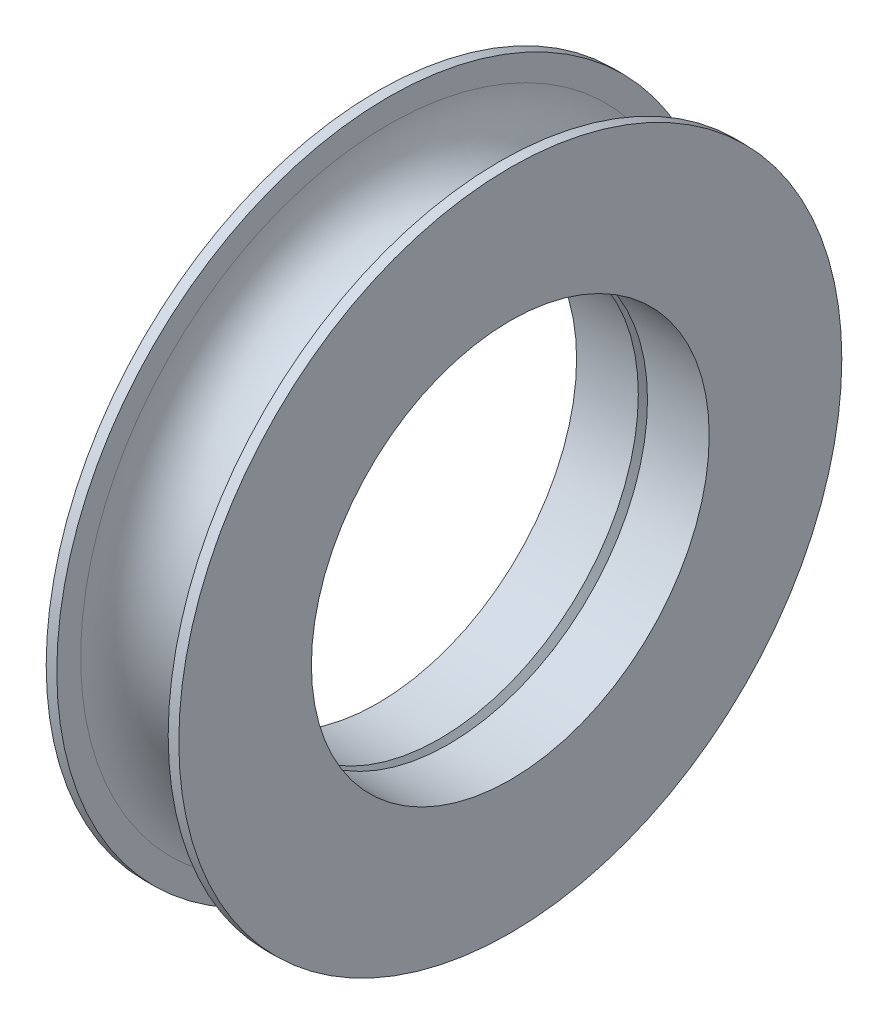
ISO-10303-21;
HEADER;
FILE_DESCRIPTION(('STEP AP214'),'2;1');
FILE_NAME('part.step','',(''),(''),'','','');
FILE_SCHEMA(('AUTOMOTIVE_DESIGN { 1 0 10303 214 1 1 1 1 }'));
ENDSEC;
DATA;
#1=APPLICATION_CONTEXT('core data for automotive mechanical design processes');
#2=APPLICATION_PROTOCOL_DEFINITION('international standard','automotive_design',2000,#1);
#3=PRODUCT_CONTEXT('',#1,'mechanical');
#4=PRODUCT('Part','Part','',(#3));
#5=PRODUCT_RELATED_PRODUCT_CATEGORY('part','',(#4));
#6=PRODUCT_DEFINITION_FORMATION('','',#4);
#7=PRODUCT_DEFINITION_CONTEXT('part definition',#1,'design');
#8=PRODUCT_DEFINITION('design','',#6,#7);
#9=PRODUCT_DEFINITION_SHAPE('','',#8);
#10=(LENGTH_UNIT() NAMED_UNIT(*) SI_UNIT(.MILLI.,.METRE.));
#11=(NAMED_UNIT(*) PLANE_ANGLE_UNIT() SI_UNIT($,.RADIAN.));
#12=(NAMED_UNIT(*) SI_UNIT($,.STERADIAN.) SOLID_ANGLE_UNIT());
#13=UNCERTAINTY_MEASURE_WITH_UNIT(LENGTH_MEASURE(1.E-05),#10,'distance_accuracy_value','');
#14=(GEOMETRIC_REPRESENTATION_CONTEXT(3) GLOBAL_UNCERTAINTY_ASSIGNED_CONTEXT((#13)) GLOBAL_UNIT_ASSIGNED_CONTEXT((#10,
#11,#12)) REPRESENTATION_CONTEXT('',''));
#15=CARTESIAN_POINT('',(0.,0.,0.));
#16=DIRECTION('',(0.,0.,1.));
#17=DIRECTION('',(1.,0.,0.));
#18=AXIS2_PLACEMENT_3D('',#15,#16,#17);
#19=CARTESIAN_POINT('',(0.,0.,0.));
#20=DIRECTION('',(-1.,0.,0.));
#21=DIRECTION('',(0.,0.,1.));
#22=AXIS2_PLACEMENT_3D('',#19,#20,#21);
#23=CONICAL_SURFACE('',#22,7.8,1.0471975511966);
#24=CARTESIAN_POINT('',(0.,0.,0.));
#25=DIRECTION('',(1.,0.,0.));
#26=DIRECTION('',(0.,0.,-1.));
#27=AXIS2_PLACEMENT_3D('',#24,#25,#26);
#28=CIRCLE('',#27,7.8);
#29=CARTESIAN_POINT('',(0.,0.,-7.8));
#30=VERTEX_POINT('',#29);
#31=EDGE_CURVE('E60',#30,#30,#28,.F.);
#32=ORIENTED_EDGE('',*,*,#31,.T.);
#33=EDGE_LOOP('',(#32));
#34=FACE_BOUND('',#33,.T.);
#35=CARTESIAN_POINT('',(0.173205080756888,0.,0.));
#36=DIRECTION('',(-1.,0.,0.));
#37=DIRECTION('',(0.,0.,1.));
#38=AXIS2_PLACEMENT_3D('',#35,#36,#37);
#39=CIRCLE('',#38,7.5);
#40=CARTESIAN_POINT('',(0.173205080756888,0.,7.5));
#41=VERTEX_POINT('',#40);
#42=EDGE_CURVE('E55',#41,#41,#39,.F.);
#43=ORIENTED_EDGE('',*,*,#42,.T.);
#44=EDGE_LOOP('',(#43));
#45=FACE_BOUND('',#44,.T.);
#46=ADVANCED_FACE('F14',(#34,#45),#23,.F.);
#47=CARTESIAN_POINT('',(0.,0.,0.));
#48=DIRECTION('',(1.,0.,0.));
#49=DIRECTION('',(0.,0.,-1.));
#50=AXIS2_PLACEMENT_3D('',#47,#48,#49);
#51=CONICAL_SURFACE('',#50,7.8,1.0471975511966);
#52=CARTESIAN_POINT('',(-0.173205080756888,0.,0.));
#53=DIRECTION('',(-1.,0.,0.));
#54=DIRECTION('',(0.,0.,1.));
#55=AXIS2_PLACEMENT_3D('',#52,#53,#54);
#56=CIRCLE('',#55,7.5);
#57=CARTESIAN_POINT('',(-0.173205080756888,0.,7.5));
#58=VERTEX_POINT('',#57);
#59=EDGE_CURVE('E51',#58,#58,#56,.T.);
#60=ORIENTED_EDGE('',*,*,#59,.T.);
#61=EDGE_LOOP('',(#60));
#62=FACE_BOUND('',#61,.T.);
#63=ORIENTED_EDGE('',*,*,#31,.F.);
#64=EDGE_LOOP('',(#63));
#65=FACE_BOUND('',#64,.T.);
#66=ADVANCED_FACE('F76',(#62,#65),#51,.F.);
#67=CARTESIAN_POINT('',(2.5,0.,0.));
#68=DIRECTION('',(-1.,0.,0.));
#69=DIRECTION('',(0.,0.,1.));
#70=AXIS2_PLACEMENT_3D('',#67,#68,#69);
#71=CYLINDRICAL_SURFACE('',#70,7.5);
#72=ORIENTED_EDGE('',*,*,#42,.F.);
#73=EDGE_LOOP('',(#72));
#74=FACE_BOUND('',#73,.T.);
#75=CARTESIAN_POINT('',(2.5,0.,0.));
#76=DIRECTION('',(-1.,0.,0.));
#77=DIRECTION('',(0.,0.,1.));
#78=AXIS2_PLACEMENT_3D('',#75,#76,#77);
#79=CIRCLE('',#78,7.5);
#80=CARTESIAN_POINT('',(2.5,0.,7.5));
#81=VERTEX_POINT('',#80);
#82=EDGE_CURVE('E17',#81,#81,#79,.T.);
#83=ORIENTED_EDGE('',*,*,#82,.F.);
#84=EDGE_LOOP('',(#83));
#85=FACE_BOUND('',#84,.T.);
#86=ADVANCED_FACE('F78',(#74,#85),#71,.F.);
#87=CARTESIAN_POINT('',(2.5,0.,0.));
#88=DIRECTION('',(-1.,0.,0.));
#89=DIRECTION('',(0.,0.,1.));
#90=AXIS2_PLACEMENT_3D('',#87,#88,#89);
#91=CYLINDRICAL_SURFACE('',#90,7.5);
#92=CARTESIAN_POINT('',(-2.5,0.,0.));
#93=DIRECTION('',(-1.,0.,0.));
#94=DIRECTION('',(0.,0.,1.));
#95=AXIS2_PLACEMENT_3D('',#92,#93,#94);
#96=CIRCLE('',#95,7.5);
#97=CARTESIAN_POINT('',(-2.5,0.,7.5));
#98=VERTEX_POINT('',#97);
#99=EDGE_CURVE('E46',#98,#98,#96,.F.);
#100=ORIENTED_EDGE('',*,*,#99,.F.);
#101=EDGE_LOOP('',(#100));
#102=FACE_BOUND('',#101,.T.);
#103=ORIENTED_EDGE('',*,*,#59,.F.);
#104=EDGE_LOOP('',(#103));
#105=FACE_BOUND('',#104,.T.);
#106=ADVANCED_FACE('F84',(#102,#105),#91,.F.);
#107=CARTESIAN_POINT('',(2.5,7.5,0.));
#108=DIRECTION('',(1.,0.,0.));
#109=DIRECTION('',(0.,0.,-1.));
#110=AXIS2_PLACEMENT_3D('',#107,#108,#109);
#111=PLANE('',#110);
#112=ORIENTED_EDGE('',*,*,#82,.T.);
#113=EDGE_LOOP('',(#112));
#114=FACE_BOUND('',#113,.T.);
#115=CARTESIAN_POINT('',(2.5,0.,0.));
#116=DIRECTION('',(-1.,0.,0.));
#117=DIRECTION('',(0.,0.,1.));
#118=AXIS2_PLACEMENT_3D('',#115,#116,#117);
#119=CIRCLE('',#118,12.5);
#120=CARTESIAN_POINT('',(2.5,0.,12.5));
#121=VERTEX_POINT('',#120);
#122=EDGE_CURVE('E44',#121,#121,#119,.T.);
#123=ORIENTED_EDGE('',*,*,#122,.F.);
#124=EDGE_LOOP('',(#123));
#125=FACE_BOUND('',#124,.T.);
#126=ADVANCED_FACE('F143',(#114,#125),#111,.T.);
#127=CARTESIAN_POINT('',(-2.5,12.5,0.));
#128=DIRECTION('',(-1.,0.,0.));
#129=DIRECTION('',(0.,0.,1.));
#130=AXIS2_PLACEMENT_3D('',#127,#128,#129);
#131=PLANE('',#130);
#132=CARTESIAN_POINT('',(-2.5,0.,0.));
#133=DIRECTION('',(-1.,0.,0.));
#134=DIRECTION('',(0.,0.,1.));
#135=AXIS2_PLACEMENT_3D('',#132,#133,#134);
#136=CIRCLE('',#135,12.5);
#137=CARTESIAN_POINT('',(-2.5,0.,12.5));
#138=VERTEX_POINT('',#137);
#139=EDGE_CURVE('E36',#138,#138,#136,.F.);
#140=ORIENTED_EDGE('',*,*,#139,.F.);
#141=EDGE_LOOP('',(#140));
#142=FACE_BOUND('',#141,.T.);
#143=ORIENTED_EDGE('',*,*,#99,.T.);
#144=EDGE_LOOP('',(#143));
#145=FACE_BOUND('',#144,.T.);
#146=ADVANCED_FACE('F139',(#142,#145),#131,.T.);
#147=CARTESIAN_POINT('',(2.5,0.,0.));
#148=DIRECTION('',(-1.,0.,0.));
#149=DIRECTION('',(0.,0.,1.));
#150=AXIS2_PLACEMENT_3D('',#147,#148,#149);
#151=CYLINDRICAL_SURFACE('',#150,12.5);
#152=ORIENTED_EDGE('',*,*,#122,.T.);
#153=EDGE_LOOP('',(#152));
#154=FACE_BOUND('',#153,.T.);
#155=CARTESIAN_POINT('',(2.1,0.,0.));
#156=DIRECTION('',(-1.,0.,0.));
#157=DIRECTION('',(0.,0.,1.));
#158=AXIS2_PLACEMENT_3D('',#155,#156,#157);
#159=CIRCLE('',#158,12.5);
#160=CARTESIAN_POINT('',(2.1,0.,12.5));
#161=VERTEX_POINT('',#160);
#162=EDGE_CURVE('E31',#161,#161,#159,.T.);
#163=ORIENTED_EDGE('',*,*,#162,.F.);
#164=EDGE_LOOP('',(#163));
#165=FACE_BOUND('',#164,.T.);
#166=ADVANCED_FACE('F135',(#154,#165),#151,.T.);
#167=CARTESIAN_POINT('',(2.5,0.,0.));
#168=DIRECTION('',(-1.,0.,0.));
#169=DIRECTION('',(0.,0.,1.));
#170=AXIS2_PLACEMENT_3D('',#167,#168,#169);
#171=CYLINDRICAL_SURFACE('',#170,12.5);
#172=CARTESIAN_POINT('',(-2.1,0.,0.));
#173=DIRECTION('',(-1.,0.,0.));
#174=DIRECTION('',(0.,0.,1.));
#175=AXIS2_PLACEMENT_3D('',#172,#173,#174);
#176=CIRCLE('',#175,12.5);
#177=CARTESIAN_POINT('',(-2.1,0.,12.5));
#178=VERTEX_POINT('',#177);
#179=EDGE_CURVE('E26',#178,#178,#176,.F.);
#180=ORIENTED_EDGE('',*,*,#179,.F.);
#181=EDGE_LOOP('',(#180));
#182=FACE_BOUND('',#181,.T.);
#183=ORIENTED_EDGE('',*,*,#139,.T.);
#184=EDGE_LOOP('',(#183));
#185=FACE_BOUND('',#184,.T.);
#186=ADVANCED_FACE('F131',(#182,#185),#171,.T.);
#187=CARTESIAN_POINT('',(2.1,12.5,0.));
#188=DIRECTION('',(-1.,0.,0.));
#189=DIRECTION('',(0.,0.,1.));
#190=AXIS2_PLACEMENT_3D('',#187,#188,#189);
#191=PLANE('',#190);
#192=ORIENTED_EDGE('',*,*,#162,.T.);
#193=EDGE_LOOP('',(#192));
#194=FACE_BOUND('',#193,.T.);
#195=CARTESIAN_POINT('',(2.1,0.,0.));
#196=DIRECTION('',(-1.,0.,0.));
#197=DIRECTION('',(0.,0.,-1.));
#198=AXIS2_PLACEMENT_3D('',#195,#196,#197);
#199=CIRCLE('',#198,11.6);
#200=CARTESIAN_POINT('',(2.1,0.,-11.6));
#201=VERTEX_POINT('',#200);
#202=EDGE_CURVE('E21',#201,#201,#199,.F.);
#203=ORIENTED_EDGE('',*,*,#202,.T.);
#204=EDGE_LOOP('',(#203));
#205=FACE_BOUND('',#204,.T.);
#206=ADVANCED_FACE('F94',(#194,#205),#191,.T.);
#207=CARTESIAN_POINT('',(-2.1,11.6,0.));
#208=DIRECTION('',(1.,0.,0.));
#209=DIRECTION('',(0.,0.,-1.));
#210=AXIS2_PLACEMENT_3D('',#207,#208,#209);
#211=PLANE('',#210);
#212=CARTESIAN_POINT('',(-2.1,0.,0.));
#213=DIRECTION('',(1.,0.,0.));
#214=DIRECTION('',(0.,0.,-1.));
#215=AXIS2_PLACEMENT_3D('',#212,#213,#214);
#216=CIRCLE('',#215,11.6);
#217=CARTESIAN_POINT('',(-2.1,0.,-11.6));
#218=VERTEX_POINT('',#217);
#219=EDGE_CURVE('E10',#218,#218,#216,.F.);
#220=ORIENTED_EDGE('',*,*,#219,.T.);
#221=EDGE_LOOP('',(#220));
#222=FACE_BOUND('',#221,.T.);
#223=ORIENTED_EDGE('',*,*,#179,.T.);
#224=EDGE_LOOP('',(#223));
#225=FACE_BOUND('',#224,.T.);
#226=ADVANCED_FACE('F89',(#222,#225),#211,.T.);
#227=CARTESIAN_POINT('',(0.,0.,0.));
#228=DIRECTION('',(1.,0.,0.));
#229=DIRECTION('',(0.,0.,-1.));
#230=AXIS2_PLACEMENT_3D('',#227,#228,#229);
#231=TOROIDAL_SURFACE('',#230,11.6,2.1);
#232=ORIENTED_EDGE('',*,*,#219,.F.);
#233=EDGE_LOOP('',(#232));
#234=FACE_BOUND('',#233,.T.);
#235=ORIENTED_EDGE('',*,*,#202,.F.);
#236=EDGE_LOOP('',(#235));
#237=FACE_BOUND('',#236,.T.);
#238=ADVANCED_FACE('F87',(#234,#237),#231,.F.);
#239=CLOSED_SHELL('',(#46,#66,#86,#106,#126,#146,#166,#186,#206,#226,#238));
#240=MANIFOLD_SOLID_BREP('B1',#239);
#241=ADVANCED_BREP_SHAPE_REPRESENTATION('',(#18,#240),#14);
#242=SHAPE_DEFINITION_REPRESENTATION(#9,#241);
ENDSEC;
END-ISO-10303-21;
